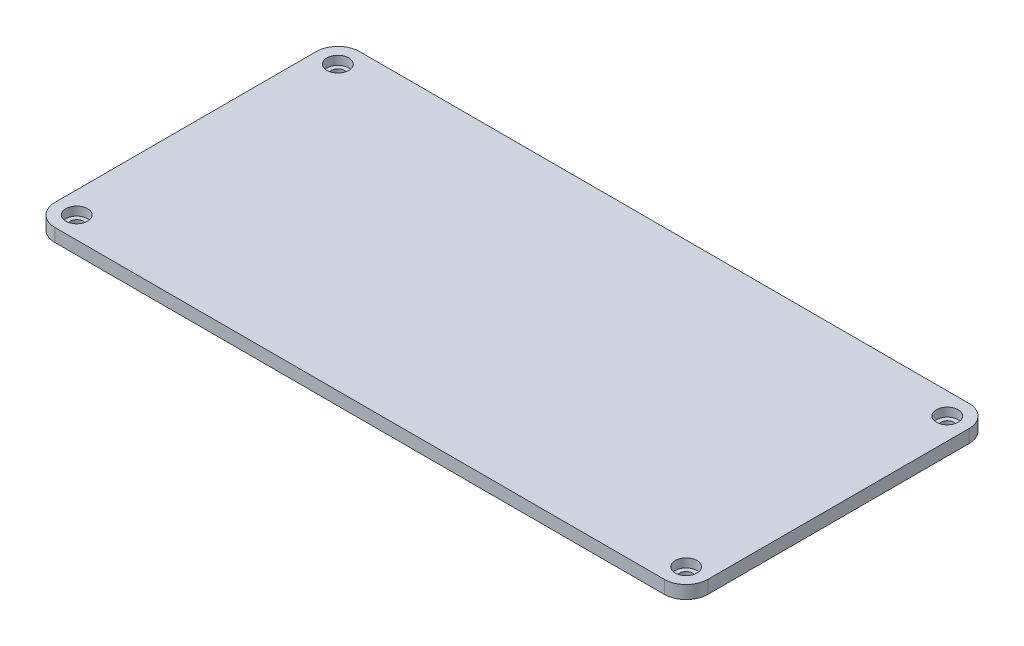
ISO-10303-21;
HEADER;
FILE_DESCRIPTION(('STEP AP214'),'2;1');
FILE_NAME('part.step','',(''),(''),'','','');
FILE_SCHEMA(('AUTOMOTIVE_DESIGN { 1 0 10303 214 1 1 1 1 }'));
ENDSEC;
DATA;
#1=APPLICATION_CONTEXT('core data for automotive mechanical design processes');
#2=APPLICATION_PROTOCOL_DEFINITION('international standard','automotive_design',2000,#1);
#3=PRODUCT_CONTEXT('',#1,'mechanical');
#4=PRODUCT('Part','Part','',(#3));
#5=PRODUCT_RELATED_PRODUCT_CATEGORY('part','',(#4));
#6=PRODUCT_DEFINITION_FORMATION('','',#4);
#7=PRODUCT_DEFINITION_CONTEXT('part definition',#1,'design');
#8=PRODUCT_DEFINITION('design','',#6,#7);
#9=PRODUCT_DEFINITION_SHAPE('','',#8);
#10=(LENGTH_UNIT() NAMED_UNIT(*) SI_UNIT(.MILLI.,.METRE.));
#11=(NAMED_UNIT(*) PLANE_ANGLE_UNIT() SI_UNIT($,.RADIAN.));
#12=(NAMED_UNIT(*) SI_UNIT($,.STERADIAN.) SOLID_ANGLE_UNIT());
#13=UNCERTAINTY_MEASURE_WITH_UNIT(LENGTH_MEASURE(1.E-05),#10,'distance_accuracy_value','');
#14=(GEOMETRIC_REPRESENTATION_CONTEXT(3) GLOBAL_UNCERTAINTY_ASSIGNED_CONTEXT((#13)) GLOBAL_UNIT_ASSIGNED_CONTEXT((#10,
#11,#12)) REPRESENTATION_CONTEXT('',''));
#15=CARTESIAN_POINT('',(0.,0.,0.));
#16=DIRECTION('',(0.,0.,1.));
#17=DIRECTION('',(1.,0.,0.));
#18=AXIS2_PLACEMENT_3D('',#15,#16,#17);
#19=CARTESIAN_POINT('',(0.,0.,0.));
#20=DIRECTION('',(0.,1.,0.));
#21=DIRECTION('',(0.,0.,1.));
#22=AXIS2_PLACEMENT_3D('',#19,#20,#21);
#23=PLANE('',#22);
#24=DIRECTION('',(0.,0.,1.));
#25=VECTOR('',#24,1.);
#26=CARTESIAN_POINT('',(30.0000000000018,0.,-32.0000000000099));
#27=LINE('',#26,#25);
#28=CARTESIAN_POINT('',(30.0000000000018,0.,-32.0000000000099));
#29=VERTEX_POINT('',#28);
#30=CARTESIAN_POINT('',(30.0000000000018,0.,-28.9999999999966));
#31=VERTEX_POINT('',#30);
#32=EDGE_CURVE('E218',#29,#31,#27,.T.);
#33=ORIENTED_EDGE('',*,*,#32,.F.);
#34=DIRECTION('',(1.,0.,0.));
#35=VECTOR('',#34,1.);
#36=CARTESIAN_POINT('',(-29.9999999999998,0.,-32.0000000000091));
#37=LINE('',#36,#35);
#38=CARTESIAN_POINT('',(-29.9999999999998,0.,-32.0000000000091));
#39=VERTEX_POINT('',#38);
#40=EDGE_CURVE('E231',#39,#29,#37,.T.);
#41=ORIENTED_EDGE('',*,*,#40,.F.);
#42=DIRECTION('',(0.,0.,-1.));
#43=VECTOR('',#42,1.);
#44=CARTESIAN_POINT('',(-29.9999999999998,0.,-32.0000000000091));
#45=LINE('',#44,#43);
#46=CARTESIAN_POINT('',(-29.9999999999998,0.,-28.9999999999968));
#47=VERTEX_POINT('',#46);
#48=EDGE_CURVE('E240',#47,#39,#45,.T.);
#49=ORIENTED_EDGE('',*,*,#48,.F.);
#50=DIRECTION('',(-1.,0.,0.));
#51=VECTOR('',#50,1.);
#52=CARTESIAN_POINT('',(-29.9999999999998,0.,-28.9999999999968));
#53=LINE('',#52,#51);
#54=EDGE_CURVE('E221',#31,#47,#53,.T.);
#55=ORIENTED_EDGE('',*,*,#54,.F.);
#56=EDGE_LOOP('',(#33,#41,#49,#55));
#57=FACE_BOUND('',#56,.T.);
#58=DIRECTION('',(-1.,0.,0.));
#59=VECTOR('',#58,1.);
#60=CARTESIAN_POINT('',(-72.000000000001,0.,14.9999999999932));
#61=LINE('',#60,#59);
#62=CARTESIAN_POINT('',(-68.9999999999886,0.,14.9999999999932));
#63=VERTEX_POINT('',#62);
#64=CARTESIAN_POINT('',(-72.000000000001,0.,14.9999999999932));
#65=VERTEX_POINT('',#64);
#66=EDGE_CURVE('E289',#63,#65,#61,.T.);
#67=ORIENTED_EDGE('',*,*,#66,.F.);
#68=DIRECTION('',(0.,0.,1.));
#69=VECTOR('',#68,1.);
#70=CARTESIAN_POINT('',(-68.9999999999886,0.,-14.9999999999898));
#71=LINE('',#70,#69);
#72=CARTESIAN_POINT('',(-68.9999999999886,0.,-14.9999999999898));
#73=VERTEX_POINT('',#72);
#74=EDGE_CURVE('E294',#73,#63,#71,.T.);
#75=ORIENTED_EDGE('',*,*,#74,.F.);
#76=DIRECTION('',(1.,0.,1.13682211791851E-12));
#77=VECTOR('',#76,1.);
#78=CARTESIAN_POINT('',(-72.0000000000017,0.,-14.9999999999932));
#79=LINE('',#78,#77);
#80=CARTESIAN_POINT('',(-72.0000000000017,0.,-14.9999999999932));
#81=VERTEX_POINT('',#80);
#82=EDGE_CURVE('E306',#81,#73,#79,.T.);
#83=ORIENTED_EDGE('',*,*,#82,.F.);
#84=DIRECTION('',(0.,0.,-1.));
#85=VECTOR('',#84,1.);
#86=CARTESIAN_POINT('',(-72.0000000000017,0.,-14.9999999999932));
#87=LINE('',#86,#85);
#88=EDGE_CURVE('E303',#65,#81,#87,.T.);
#89=ORIENTED_EDGE('',*,*,#88,.F.);
#90=EDGE_LOOP('',(#67,#75,#83,#89));
#91=FACE_BOUND('',#90,.T.);
#92=CARTESIAN_POINT('',(-69.9999999999926,0.,29.9999999999983));
#93=DIRECTION('',(0.,1.,0.));
#94=DIRECTION('',(0.,0.,1.));
#95=AXIS2_PLACEMENT_3D('',#92,#93,#94);
#96=CIRCLE('',#95,1.5);
#97=CARTESIAN_POINT('',(-69.9999999999926,0.,31.4999999999983));
#98=VERTEX_POINT('',#97);
#99=EDGE_CURVE('E354',#98,#98,#96,.T.);
#100=ORIENTED_EDGE('',*,*,#99,.T.);
#101=EDGE_LOOP('',(#100));
#102=FACE_BOUND('',#101,.T.);
#103=CARTESIAN_POINT('',(70.0000000000035,0.,29.9999999999975));
#104=DIRECTION('',(0.,1.,0.));
#105=DIRECTION('',(0.,0.,1.));
#106=AXIS2_PLACEMENT_3D('',#103,#104,#105);
#107=CIRCLE('',#106,1.5);
#108=CARTESIAN_POINT('',(70.0000000000035,0.,31.4999999999975));
#109=VERTEX_POINT('',#108);
#110=EDGE_CURVE('E351',#109,#109,#107,.T.);
#111=ORIENTED_EDGE('',*,*,#110,.T.);
#112=EDGE_LOOP('',(#111));
#113=FACE_BOUND('',#112,.T.);
#114=CARTESIAN_POINT('',(70.0000000000035,0.,-29.9999999999975));
#115=DIRECTION('',(0.,1.,0.));
#116=DIRECTION('',(0.,0.,1.));
#117=AXIS2_PLACEMENT_3D('',#114,#115,#116);
#118=CIRCLE('',#117,1.5);
#119=CARTESIAN_POINT('',(70.0000000000035,0.,-28.4999999999975));
#120=VERTEX_POINT('',#119);
#121=EDGE_CURVE('E347',#120,#120,#118,.T.);
#122=ORIENTED_EDGE('',*,*,#121,.T.);
#123=EDGE_LOOP('',(#122));
#124=FACE_BOUND('',#123,.T.);
#125=CARTESIAN_POINT('',(-69.9999999999926,0.,-29.9999999999983));
#126=DIRECTION('',(0.,1.,0.));
#127=DIRECTION('',(0.,0.,1.));
#128=AXIS2_PLACEMENT_3D('',#125,#126,#127);
#129=CIRCLE('',#128,1.5);
#130=CARTESIAN_POINT('',(-69.9999999999926,0.,-28.4999999999983));
#131=VERTEX_POINT('',#130);
#132=EDGE_CURVE('E350',#131,#131,#129,.T.);
#133=ORIENTED_EDGE('',*,*,#132,.T.);
#134=EDGE_LOOP('',(#133));
#135=FACE_BOUND('',#134,.T.);
#136=DIRECTION('',(-1.,0.,0.));
#137=VECTOR('',#136,1.);
#138=CARTESIAN_POINT('',(-74.9999999999926,0.,-34.9999999999983));
#139=LINE('',#138,#137);
#140=CARTESIAN_POINT('',(70.0000000000035,0.,-34.9999999999975));
#141=VERTEX_POINT('',#140);
#142=CARTESIAN_POINT('',(-69.9999999999925,0.,-34.9999999999983));
#143=VERTEX_POINT('',#142);
#144=EDGE_CURVE('E359',#141,#143,#139,.T.);
#145=ORIENTED_EDGE('',*,*,#144,.F.);
#146=CARTESIAN_POINT('',(70.0000000000035,0.,-29.9999999999975));
#147=DIRECTION('',(0.,1.,0.));
#148=DIRECTION('',(0.,0.,1.));
#149=AXIS2_PLACEMENT_3D('',#146,#147,#148);
#150=CIRCLE('',#149,5.);
#151=CARTESIAN_POINT('',(75.0000000000035,0.,-29.9999999999975));
#152=VERTEX_POINT('',#151);
#153=EDGE_CURVE('E394',#141,#152,#150,.F.);
#154=ORIENTED_EDGE('',*,*,#153,.T.);
#155=DIRECTION('',(0.,0.,-1.));
#156=VECTOR('',#155,1.);
#157=CARTESIAN_POINT('',(75.0000000000035,0.,34.9999999999974));
#158=LINE('',#157,#156);
#159=CARTESIAN_POINT('',(75.0000000000035,0.,29.9999999999975));
#160=VERTEX_POINT('',#159);
#161=EDGE_CURVE('E364',#160,#152,#158,.T.);
#162=ORIENTED_EDGE('',*,*,#161,.F.);
#163=CARTESIAN_POINT('',(70.0000000000035,0.,29.9999999999975));
#164=DIRECTION('',(0.,1.,0.));
#165=DIRECTION('',(0.,0.,1.));
#166=AXIS2_PLACEMENT_3D('',#163,#164,#165);
#167=CIRCLE('',#166,5.);
#168=CARTESIAN_POINT('',(70.0000000000035,0.,34.9999999999975));
#169=VERTEX_POINT('',#168);
#170=EDGE_CURVE('E390',#160,#169,#167,.F.);
#171=ORIENTED_EDGE('',*,*,#170,.T.);
#172=DIRECTION('',(1.,0.,0.));
#173=VECTOR('',#172,1.);
#174=CARTESIAN_POINT('',(-74.9999999999926,0.,34.9999999999983));
#175=LINE('',#174,#173);
#176=CARTESIAN_POINT('',(-69.9999999999925,0.,34.9999999999983));
#177=VERTEX_POINT('',#176);
#178=EDGE_CURVE('E379',#177,#169,#175,.T.);
#179=ORIENTED_EDGE('',*,*,#178,.F.);
#180=CARTESIAN_POINT('',(-69.9999999999926,0.,29.9999999999983));
#181=DIRECTION('',(0.,1.,0.));
#182=DIRECTION('',(0.,0.,1.));
#183=AXIS2_PLACEMENT_3D('',#180,#181,#182);
#184=CIRCLE('',#183,5.);
#185=CARTESIAN_POINT('',(-74.9999999999926,0.,29.9999999999983));
#186=VERTEX_POINT('',#185);
#187=EDGE_CURVE('E388',#177,#186,#184,.F.);
#188=ORIENTED_EDGE('',*,*,#187,.T.);
#189=DIRECTION('',(0.,0.,1.));
#190=VECTOR('',#189,1.);
#191=CARTESIAN_POINT('',(-74.9999999999926,0.,34.9999999999983));
#192=LINE('',#191,#190);
#193=CARTESIAN_POINT('',(-74.9999999999926,0.,-29.9999999999983));
#194=VERTEX_POINT('',#193);
#195=EDGE_CURVE('E376',#194,#186,#192,.T.);
#196=ORIENTED_EDGE('',*,*,#195,.F.);
#197=CARTESIAN_POINT('',(-69.9999999999926,0.,-29.9999999999983));
#198=DIRECTION('',(0.,1.,0.));
#199=DIRECTION('',(0.,0.,1.));
#200=AXIS2_PLACEMENT_3D('',#197,#198,#199);
#201=CIRCLE('',#200,5.);
#202=EDGE_CURVE('E392',#194,#143,#201,.F.);
#203=ORIENTED_EDGE('',*,*,#202,.T.);
#204=EDGE_LOOP('',(#145,#154,#162,#171,#179,#188,#196,#203));
#205=FACE_BOUND('',#204,.T.);
#206=DIRECTION('',(0.,0.,-1.));
#207=VECTOR('',#206,1.);
#208=CARTESIAN_POINT('',(-29.9999999999988,0.,28.9999999999973));
#209=LINE('',#208,#207);
#210=CARTESIAN_POINT('',(-29.9999999999988,0.,32.0000000000044));
#211=VERTEX_POINT('',#210);
#212=CARTESIAN_POINT('',(-29.9999999999988,0.,28.9999999999973));
#213=VERTEX_POINT('',#212);
#214=EDGE_CURVE('E256',#211,#213,#209,.T.);
#215=ORIENTED_EDGE('',*,*,#214,.F.);
#216=DIRECTION('',(-1.,0.,0.));
#217=VECTOR('',#216,1.);
#218=CARTESIAN_POINT('',(-29.9999999999988,0.,32.0000000000044));
#219=LINE('',#218,#217);
#220=CARTESIAN_POINT('',(30.0000000000035,0.,32.0000000000044));
#221=VERTEX_POINT('',#220);
#222=EDGE_CURVE('E261',#221,#211,#219,.T.);
#223=ORIENTED_EDGE('',*,*,#222,.F.);
#224=DIRECTION('',(0.,0.,1.));
#225=VECTOR('',#224,1.);
#226=CARTESIAN_POINT('',(30.0000000000035,0.,28.9999999999968));
#227=LINE('',#226,#225);
#228=CARTESIAN_POINT('',(30.0000000000035,0.,28.9999999999968));
#229=VERTEX_POINT('',#228);
#230=EDGE_CURVE('E273',#229,#221,#227,.T.);
#231=ORIENTED_EDGE('',*,*,#230,.F.);
#232=DIRECTION('',(1.,0.,0.));
#233=VECTOR('',#232,1.);
#234=CARTESIAN_POINT('',(-29.9999999999988,0.,28.9999999999973));
#235=LINE('',#234,#233);
#236=EDGE_CURVE('E270',#213,#229,#235,.T.);
#237=ORIENTED_EDGE('',*,*,#236,.F.);
#238=EDGE_LOOP('',(#215,#223,#231,#237));
#239=FACE_BOUND('',#238,.T.);
#240=DIRECTION('',(-1.,0.,0.));
#241=VECTOR('',#240,1.);
#242=CARTESIAN_POINT('',(69.000000000007,0.,14.9999999999932));
#243=LINE('',#242,#241);
#244=CARTESIAN_POINT('',(72.000000000007,0.,14.9999999999932));
#245=VERTEX_POINT('',#244);
#246=CARTESIAN_POINT('',(69.000000000007,0.,14.9999999999932));
#247=VERTEX_POINT('',#246);
#248=EDGE_CURVE('E217',#245,#247,#243,.T.);
#249=ORIENTED_EDGE('',*,*,#248,.F.);
#250=DIRECTION('',(0.,0.,1.));
#251=VECTOR('',#250,1.);
#252=CARTESIAN_POINT('',(72.000000000007,0.,-14.9999999999588));
#253=LINE('',#252,#251);
#254=CARTESIAN_POINT('',(72.000000000007,0.,-14.9999999999588));
#255=VERTEX_POINT('',#254);
#256=EDGE_CURVE('E214',#255,#245,#253,.T.);
#257=ORIENTED_EDGE('',*,*,#256,.F.);
#258=DIRECTION('',(1.,0.,0.));
#259=VECTOR('',#258,1.);
#260=CARTESIAN_POINT('',(69.000000000007,0.,-14.9999999999588));
#261=LINE('',#260,#259);
#262=CARTESIAN_POINT('',(69.000000000007,0.,-14.9999999999588));
#263=VERTEX_POINT('',#262);
#264=EDGE_CURVE('E57',#263,#255,#261,.T.);
#265=ORIENTED_EDGE('',*,*,#264,.F.);
#266=DIRECTION('',(0.,0.,-1.));
#267=VECTOR('',#266,1.);
#268=CARTESIAN_POINT('',(69.000000000007,0.,-14.9999999999588));
#269=LINE('',#268,#267);
#270=EDGE_CURVE('E52',#247,#263,#269,.T.);
#271=ORIENTED_EDGE('',*,*,#270,.F.);
#272=EDGE_LOOP('',(#249,#257,#265,#271));
#273=FACE_BOUND('',#272,.T.);
#274=ADVANCED_FACE('F35',(#57,#91,#102,#113,#124,#135,#205,#239,#273),#23,.F.);
#275=CARTESIAN_POINT('',(-69.9999999999926,0.,-29.9999999999983));
#276=DIRECTION('',(0.,1.,0.));
#277=DIRECTION('',(0.,0.,1.));
#278=AXIS2_PLACEMENT_3D('',#275,#276,#277);
#279=CYLINDRICAL_SURFACE('',#278,1.5);
#280=ORIENTED_EDGE('',*,*,#132,.F.);
#281=EDGE_LOOP('',(#280));
#282=FACE_BOUND('',#281,.T.);
#283=CARTESIAN_POINT('',(-69.9999999999926,1.,-29.9999999999983));
#284=DIRECTION('',(0.,1.,0.));
#285=DIRECTION('',(0.,0.,1.));
#286=AXIS2_PLACEMENT_3D('',#283,#284,#285);
#287=CIRCLE('',#286,1.5);
#288=CARTESIAN_POINT('',(-69.9999999999926,1.,-28.4999999999983));
#289=VERTEX_POINT('',#288);
#290=EDGE_CURVE('E39',#289,#289,#287,.F.);
#291=ORIENTED_EDGE('',*,*,#290,.F.);
#292=EDGE_LOOP('',(#291));
#293=FACE_BOUND('',#292,.T.);
#294=ADVANCED_FACE('F429',(#282,#293),#279,.F.);
#295=CARTESIAN_POINT('',(70.0000000000035,0.,-29.9999999999975));
#296=DIRECTION('',(0.,1.,0.));
#297=DIRECTION('',(0.,0.,1.));
#298=AXIS2_PLACEMENT_3D('',#295,#296,#297);
#299=CYLINDRICAL_SURFACE('',#298,1.5);
#300=ORIENTED_EDGE('',*,*,#121,.F.);
#301=EDGE_LOOP('',(#300));
#302=FACE_BOUND('',#301,.T.);
#303=CARTESIAN_POINT('',(70.0000000000035,1.,-29.9999999999975));
#304=DIRECTION('',(0.,1.,0.));
#305=DIRECTION('',(0.,0.,1.));
#306=AXIS2_PLACEMENT_3D('',#303,#304,#305);
#307=CIRCLE('',#306,1.5);
#308=CARTESIAN_POINT('',(70.0000000000035,1.,-28.4999999999975));
#309=VERTEX_POINT('',#308);
#310=EDGE_CURVE('E420',#309,#309,#307,.F.);
#311=ORIENTED_EDGE('',*,*,#310,.F.);
#312=EDGE_LOOP('',(#311));
#313=FACE_BOUND('',#312,.T.);
#314=ADVANCED_FACE('F431',(#302,#313),#299,.F.);
#315=CARTESIAN_POINT('',(70.0000000000035,0.,29.9999999999975));
#316=DIRECTION('',(0.,1.,0.));
#317=DIRECTION('',(0.,0.,1.));
#318=AXIS2_PLACEMENT_3D('',#315,#316,#317);
#319=CYLINDRICAL_SURFACE('',#318,1.5);
#320=ORIENTED_EDGE('',*,*,#110,.F.);
#321=EDGE_LOOP('',(#320));
#322=FACE_BOUND('',#321,.T.);
#323=CARTESIAN_POINT('',(70.0000000000035,1.,29.9999999999975));
#324=DIRECTION('',(0.,1.,0.));
#325=DIRECTION('',(0.,0.,1.));
#326=AXIS2_PLACEMENT_3D('',#323,#324,#325);
#327=CIRCLE('',#326,1.5);
#328=CARTESIAN_POINT('',(70.0000000000035,1.,31.4999999999975));
#329=VERTEX_POINT('',#328);
#330=EDGE_CURVE('E418',#329,#329,#327,.F.);
#331=ORIENTED_EDGE('',*,*,#330,.F.);
#332=EDGE_LOOP('',(#331));
#333=FACE_BOUND('',#332,.T.);
#334=ADVANCED_FACE('F438',(#322,#333),#319,.F.);
#335=CARTESIAN_POINT('',(-69.9999999999926,0.,29.9999999999983));
#336=DIRECTION('',(0.,1.,0.));
#337=DIRECTION('',(0.,0.,1.));
#338=AXIS2_PLACEMENT_3D('',#335,#336,#337);
#339=CYLINDRICAL_SURFACE('',#338,1.5);
#340=ORIENTED_EDGE('',*,*,#99,.F.);
#341=EDGE_LOOP('',(#340));
#342=FACE_BOUND('',#341,.T.);
#343=CARTESIAN_POINT('',(-69.9999999999926,1.,29.9999999999983));
#344=DIRECTION('',(0.,1.,0.));
#345=DIRECTION('',(0.,0.,1.));
#346=AXIS2_PLACEMENT_3D('',#343,#344,#345);
#347=CIRCLE('',#346,1.5);
#348=CARTESIAN_POINT('',(-69.9999999999926,1.,31.4999999999983));
#349=VERTEX_POINT('',#348);
#350=EDGE_CURVE('E344',#349,#349,#347,.F.);
#351=ORIENTED_EDGE('',*,*,#350,.F.);
#352=EDGE_LOOP('',(#351));
#353=FACE_BOUND('',#352,.T.);
#354=ADVANCED_FACE('F446',(#342,#353),#339,.F.);
#355=CARTESIAN_POINT('',(-74.9999999999926,3.,-34.9999999999983));
#356=DIRECTION('',(0.,0.,1.));
#357=DIRECTION('',(1.,0.,0.));
#358=AXIS2_PLACEMENT_3D('',#355,#356,#357);
#359=PLANE('',#358);
#360=DIRECTION('',(-1.,0.,0.));
#361=VECTOR('',#360,1.);
#362=CARTESIAN_POINT('',(-74.9999999999926,3.,-34.9999999999983));
#363=LINE('',#362,#361);
#364=CARTESIAN_POINT('',(70.0000000000035,3.,-34.9999999999975));
#365=VERTEX_POINT('',#364);
#366=CARTESIAN_POINT('',(-69.9999999999925,3.,-34.9999999999983));
#367=VERTEX_POINT('',#366);
#368=EDGE_CURVE('E360',#365,#367,#363,.T.);
#369=ORIENTED_EDGE('',*,*,#368,.F.);
#370=DIRECTION('',(0.,-1.,0.));
#371=VECTOR('',#370,1.);
#372=CARTESIAN_POINT('',(70.0000000000035,3.,-34.9999999999975));
#373=LINE('',#372,#371);
#374=EDGE_CURVE('E385',#365,#141,#373,.T.);
#375=ORIENTED_EDGE('',*,*,#374,.T.);
#376=ORIENTED_EDGE('',*,*,#144,.T.);
#377=DIRECTION('',(0.,-1.,0.));
#378=VECTOR('',#377,1.);
#379=CARTESIAN_POINT('',(-69.9999999999925,3.,-34.9999999999983));
#380=LINE('',#379,#378);
#381=EDGE_CURVE('E373',#143,#367,#380,.F.);
#382=ORIENTED_EDGE('',*,*,#381,.T.);
#383=EDGE_LOOP('',(#369,#375,#376,#382));
#384=FACE_BOUND('',#383,.T.);
#385=ADVANCED_FACE('F464',(#384),#359,.F.);
#386=CARTESIAN_POINT('',(-74.9999999999926,3.,34.9999999999983));
#387=DIRECTION('',(1.,0.,0.));
#388=DIRECTION('',(0.,0.,-1.));
#389=AXIS2_PLACEMENT_3D('',#386,#387,#388);
#390=PLANE('',#389);
#391=DIRECTION('',(0.,0.,1.));
#392=VECTOR('',#391,1.);
#393=CARTESIAN_POINT('',(-74.9999999999926,3.,34.9999999999983));
#394=LINE('',#393,#392);
#395=CARTESIAN_POINT('',(-74.9999999999926,3.,-29.9999999999983));
#396=VERTEX_POINT('',#395);
#397=CARTESIAN_POINT('',(-74.9999999999926,3.,29.9999999999983));
#398=VERTEX_POINT('',#397);
#399=EDGE_CURVE('E363',#396,#398,#394,.T.);
#400=ORIENTED_EDGE('',*,*,#399,.F.);
#401=DIRECTION('',(0.,-1.,0.));
#402=VECTOR('',#401,1.);
#403=CARTESIAN_POINT('',(-74.9999999999926,3.,-29.9999999999983));
#404=LINE('',#403,#402);
#405=EDGE_CURVE('E411',#396,#194,#404,.T.);
#406=ORIENTED_EDGE('',*,*,#405,.T.);
#407=ORIENTED_EDGE('',*,*,#195,.T.);
#408=DIRECTION('',(0.,-1.,0.));
#409=VECTOR('',#408,1.);
#410=CARTESIAN_POINT('',(-74.9999999999926,3.,29.9999999999983));
#411=LINE('',#410,#409);
#412=EDGE_CURVE('E409',#186,#398,#411,.F.);
#413=ORIENTED_EDGE('',*,*,#412,.T.);
#414=EDGE_LOOP('',(#400,#406,#407,#413));
#415=FACE_BOUND('',#414,.T.);
#416=ADVANCED_FACE('F460',(#415),#390,.F.);
#417=CARTESIAN_POINT('',(-74.9999999999926,3.,34.9999999999983));
#418=DIRECTION('',(0.,0.,-1.));
#419=DIRECTION('',(-1.,0.,0.));
#420=AXIS2_PLACEMENT_3D('',#417,#418,#419);
#421=PLANE('',#420);
#422=ORIENTED_EDGE('',*,*,#178,.T.);
#423=DIRECTION('',(0.,-1.,0.));
#424=VECTOR('',#423,1.);
#425=CARTESIAN_POINT('',(70.0000000000035,3.,34.9999999999975));
#426=LINE('',#425,#424);
#427=CARTESIAN_POINT('',(70.0000000000035,3.,34.9999999999975));
#428=VERTEX_POINT('',#427);
#429=EDGE_CURVE('E11',#169,#428,#426,.F.);
#430=ORIENTED_EDGE('',*,*,#429,.T.);
#431=DIRECTION('',(1.,0.,0.));
#432=VECTOR('',#431,1.);
#433=CARTESIAN_POINT('',(-74.9999999999926,3.,34.9999999999983));
#434=LINE('',#433,#432);
#435=CARTESIAN_POINT('',(-69.9999999999925,3.,34.9999999999983));
#436=VERTEX_POINT('',#435);
#437=EDGE_CURVE('E367',#436,#428,#434,.T.);
#438=ORIENTED_EDGE('',*,*,#437,.F.);
#439=DIRECTION('',(0.,-1.,0.));
#440=VECTOR('',#439,1.);
#441=CARTESIAN_POINT('',(-69.9999999999925,3.,34.9999999999983));
#442=LINE('',#441,#440);
#443=EDGE_CURVE('E44',#436,#177,#442,.T.);
#444=ORIENTED_EDGE('',*,*,#443,.T.);
#445=EDGE_LOOP('',(#422,#430,#438,#444));
#446=FACE_BOUND('',#445,.T.);
#447=ADVANCED_FACE('F456',(#446),#421,.F.);
#448=CARTESIAN_POINT('',(75.0000000000035,3.,34.9999999999974));
#449=DIRECTION('',(-1.,0.,0.));
#450=DIRECTION('',(0.,0.,1.));
#451=AXIS2_PLACEMENT_3D('',#448,#449,#450);
#452=PLANE('',#451);
#453=ORIENTED_EDGE('',*,*,#161,.T.);
#454=DIRECTION('',(0.,-1.,0.));
#455=VECTOR('',#454,1.);
#456=CARTESIAN_POINT('',(75.0000000000035,3.,-29.9999999999975));
#457=LINE('',#456,#455);
#458=CARTESIAN_POINT('',(75.0000000000035,3.,-29.9999999999975));
#459=VERTEX_POINT('',#458);
#460=EDGE_CURVE('E399',#152,#459,#457,.F.);
#461=ORIENTED_EDGE('',*,*,#460,.T.);
#462=DIRECTION('',(0.,0.,-1.));
#463=VECTOR('',#462,1.);
#464=CARTESIAN_POINT('',(75.0000000000035,3.,34.9999999999974));
#465=LINE('',#464,#463);
#466=CARTESIAN_POINT('',(75.0000000000035,3.,29.9999999999975));
#467=VERTEX_POINT('',#466);
#468=EDGE_CURVE('E370',#467,#459,#465,.T.);
#469=ORIENTED_EDGE('',*,*,#468,.F.);
#470=DIRECTION('',(0.,-1.,0.));
#471=VECTOR('',#470,1.);
#472=CARTESIAN_POINT('',(75.0000000000035,3.,29.9999999999975));
#473=LINE('',#472,#471);
#474=EDGE_CURVE('E396',#467,#160,#473,.T.);
#475=ORIENTED_EDGE('',*,*,#474,.T.);
#476=EDGE_LOOP('',(#453,#461,#469,#475));
#477=FACE_BOUND('',#476,.T.);
#478=ADVANCED_FACE('F451',(#477),#452,.F.);
#479=CARTESIAN_POINT('',(0.,3.,0.));
#480=DIRECTION('',(0.,1.,0.));
#481=DIRECTION('',(0.,0.,1.));
#482=AXIS2_PLACEMENT_3D('',#479,#480,#481);
#483=PLANE('',#482);
#484=CARTESIAN_POINT('',(-69.9999999999926,3.,29.9999999999983));
#485=DIRECTION('',(0.,1.,0.));
#486=DIRECTION('',(0.,0.,1.));
#487=AXIS2_PLACEMENT_3D('',#484,#485,#486);
#488=CIRCLE('',#487,2.5);
#489=CARTESIAN_POINT('',(-69.9999999999926,3.,32.4999999999983));
#490=VERTEX_POINT('',#489);
#491=EDGE_CURVE('E322',#490,#490,#488,.T.);
#492=ORIENTED_EDGE('',*,*,#491,.F.);
#493=EDGE_LOOP('',(#492));
#494=FACE_BOUND('',#493,.T.);
#495=CARTESIAN_POINT('',(70.0000000000035,3.,29.9999999999975));
#496=DIRECTION('',(0.,1.,0.));
#497=DIRECTION('',(0.,0.,1.));
#498=AXIS2_PLACEMENT_3D('',#495,#496,#497);
#499=CIRCLE('',#498,2.5);
#500=CARTESIAN_POINT('',(70.0000000000035,3.,32.4999999999975));
#501=VERTEX_POINT('',#500);
#502=EDGE_CURVE('E333',#501,#501,#499,.T.);
#503=ORIENTED_EDGE('',*,*,#502,.F.);
#504=EDGE_LOOP('',(#503));
#505=FACE_BOUND('',#504,.T.);
#506=CARTESIAN_POINT('',(70.0000000000035,3.,-29.9999999999975));
#507=DIRECTION('',(0.,1.,0.));
#508=DIRECTION('',(0.,0.,1.));
#509=AXIS2_PLACEMENT_3D('',#506,#507,#508);
#510=CIRCLE('',#509,2.5);
#511=CARTESIAN_POINT('',(70.0000000000035,3.,-27.4999999999975));
#512=VERTEX_POINT('',#511);
#513=EDGE_CURVE('E327',#512,#512,#510,.T.);
#514=ORIENTED_EDGE('',*,*,#513,.F.);
#515=EDGE_LOOP('',(#514));
#516=FACE_BOUND('',#515,.T.);
#517=CARTESIAN_POINT('',(-69.9999999999926,3.,-29.9999999999983));
#518=DIRECTION('',(0.,1.,0.));
#519=DIRECTION('',(0.,0.,1.));
#520=AXIS2_PLACEMENT_3D('',#517,#518,#519);
#521=CIRCLE('',#520,2.5);
#522=CARTESIAN_POINT('',(-69.9999999999926,3.,-27.4999999999983));
#523=VERTEX_POINT('',#522);
#524=EDGE_CURVE('E326',#523,#523,#521,.T.);
#525=ORIENTED_EDGE('',*,*,#524,.F.);
#526=EDGE_LOOP('',(#525));
#527=FACE_BOUND('',#526,.T.);
#528=ORIENTED_EDGE('',*,*,#468,.T.);
#529=CARTESIAN_POINT('',(70.0000000000035,3.,-29.9999999999975));
#530=DIRECTION('',(0.,1.,0.));
#531=DIRECTION('',(0.,0.,1.));
#532=AXIS2_PLACEMENT_3D('',#529,#530,#531);
#533=CIRCLE('',#532,5.);
#534=EDGE_CURVE('E407',#459,#365,#533,.T.);
#535=ORIENTED_EDGE('',*,*,#534,.T.);
#536=ORIENTED_EDGE('',*,*,#368,.T.);
#537=CARTESIAN_POINT('',(-69.9999999999926,3.,-29.9999999999983));
#538=DIRECTION('',(0.,1.,0.));
#539=DIRECTION('',(0.,0.,1.));
#540=AXIS2_PLACEMENT_3D('',#537,#538,#539);
#541=CIRCLE('',#540,5.);
#542=EDGE_CURVE('E405',#367,#396,#541,.T.);
#543=ORIENTED_EDGE('',*,*,#542,.T.);
#544=ORIENTED_EDGE('',*,*,#399,.T.);
#545=CARTESIAN_POINT('',(-69.9999999999926,3.,29.9999999999983));
#546=DIRECTION('',(0.,1.,0.));
#547=DIRECTION('',(0.,0.,1.));
#548=AXIS2_PLACEMENT_3D('',#545,#546,#547);
#549=CIRCLE('',#548,5.);
#550=EDGE_CURVE('E401',#398,#436,#549,.T.);
#551=ORIENTED_EDGE('',*,*,#550,.T.);
#552=ORIENTED_EDGE('',*,*,#437,.T.);
#553=CARTESIAN_POINT('',(70.0000000000035,3.,29.9999999999975));
#554=DIRECTION('',(0.,1.,0.));
#555=DIRECTION('',(0.,0.,1.));
#556=AXIS2_PLACEMENT_3D('',#553,#554,#555);
#557=CIRCLE('',#556,5.);
#558=EDGE_CURVE('E403',#428,#467,#557,.T.);
#559=ORIENTED_EDGE('',*,*,#558,.T.);
#560=EDGE_LOOP('',(#528,#535,#536,#543,#544,#551,#552,#559));
#561=FACE_BOUND('',#560,.T.);
#562=ADVANCED_FACE('F448',(#494,#505,#516,#527,#561),#483,.T.);
#563=CARTESIAN_POINT('',(70.0000000000035,3.,-29.9999999999975));
#564=DIRECTION('',(0.,-1.,0.));
#565=DIRECTION('',(0.,0.,-1.));
#566=AXIS2_PLACEMENT_3D('',#563,#564,#565);
#567=CYLINDRICAL_SURFACE('',#566,5.);
#568=ORIENTED_EDGE('',*,*,#534,.F.);
#569=ORIENTED_EDGE('',*,*,#460,.F.);
#570=ORIENTED_EDGE('',*,*,#153,.F.);
#571=ORIENTED_EDGE('',*,*,#374,.F.);
#572=EDGE_LOOP('',(#568,#569,#570,#571));
#573=FACE_BOUND('',#572,.T.);
#574=ADVANCED_FACE('F450',(#573),#567,.T.);
#575=CARTESIAN_POINT('',(-69.9999999999926,3.,-29.9999999999983));
#576=DIRECTION('',(0.,-1.,0.));
#577=DIRECTION('',(0.,0.,-1.));
#578=AXIS2_PLACEMENT_3D('',#575,#576,#577);
#579=CYLINDRICAL_SURFACE('',#578,5.);
#580=ORIENTED_EDGE('',*,*,#542,.F.);
#581=ORIENTED_EDGE('',*,*,#381,.F.);
#582=ORIENTED_EDGE('',*,*,#202,.F.);
#583=ORIENTED_EDGE('',*,*,#405,.F.);
#584=EDGE_LOOP('',(#580,#581,#582,#583));
#585=FACE_BOUND('',#584,.T.);
#586=ADVANCED_FACE('F471',(#585),#579,.T.);
#587=CARTESIAN_POINT('',(70.0000000000035,3.,29.9999999999975));
#588=DIRECTION('',(0.,-1.,0.));
#589=DIRECTION('',(0.,0.,-1.));
#590=AXIS2_PLACEMENT_3D('',#587,#588,#589);
#591=CYLINDRICAL_SURFACE('',#590,5.);
#592=ORIENTED_EDGE('',*,*,#558,.F.);
#593=ORIENTED_EDGE('',*,*,#429,.F.);
#594=ORIENTED_EDGE('',*,*,#170,.F.);
#595=ORIENTED_EDGE('',*,*,#474,.F.);
#596=EDGE_LOOP('',(#592,#593,#594,#595));
#597=FACE_BOUND('',#596,.T.);
#598=ADVANCED_FACE('F474',(#597),#591,.T.);
#599=CARTESIAN_POINT('',(-69.9999999999926,3.,29.9999999999983));
#600=DIRECTION('',(0.,-1.,0.));
#601=DIRECTION('',(0.,0.,-1.));
#602=AXIS2_PLACEMENT_3D('',#599,#600,#601);
#603=CYLINDRICAL_SURFACE('',#602,5.);
#604=ORIENTED_EDGE('',*,*,#550,.F.);
#605=ORIENTED_EDGE('',*,*,#412,.F.);
#606=ORIENTED_EDGE('',*,*,#187,.F.);
#607=ORIENTED_EDGE('',*,*,#443,.F.);
#608=EDGE_LOOP('',(#604,#605,#606,#607));
#609=FACE_BOUND('',#608,.T.);
#610=ADVANCED_FACE('F37',(#609),#603,.T.);
#611=CARTESIAN_POINT('',(-69.9999999999926,1.,29.9999999999983));
#612=DIRECTION('',(0.,1.,0.));
#613=DIRECTION('',(0.,0.,1.));
#614=AXIS2_PLACEMENT_3D('',#611,#612,#613);
#615=PLANE('',#614);
#616=CARTESIAN_POINT('',(-69.9999999999926,1.,29.9999999999983));
#617=DIRECTION('',(0.,1.,0.));
#618=DIRECTION('',(0.,0.,1.));
#619=AXIS2_PLACEMENT_3D('',#616,#617,#618);
#620=CIRCLE('',#619,2.5);
#621=CARTESIAN_POINT('',(-69.9999999999926,1.,32.4999999999983));
#622=VERTEX_POINT('',#621);
#623=EDGE_CURVE('E336',#622,#622,#620,.T.);
#624=ORIENTED_EDGE('',*,*,#623,.T.);
#625=EDGE_LOOP('',(#624));
#626=FACE_BOUND('',#625,.T.);
#627=ORIENTED_EDGE('',*,*,#350,.T.);
#628=EDGE_LOOP('',(#627));
#629=FACE_BOUND('',#628,.T.);
#630=ADVANCED_FACE('F481',(#626,#629),#615,.T.);
#631=CARTESIAN_POINT('',(-69.9999999999926,1.,29.9999999999983));
#632=DIRECTION('',(0.,1.,0.));
#633=DIRECTION('',(0.,0.,1.));
#634=AXIS2_PLACEMENT_3D('',#631,#632,#633);
#635=CYLINDRICAL_SURFACE('',#634,2.5);
#636=ORIENTED_EDGE('',*,*,#623,.F.);
#637=EDGE_LOOP('',(#636));
#638=FACE_BOUND('',#637,.T.);
#639=ORIENTED_EDGE('',*,*,#491,.T.);
#640=EDGE_LOOP('',(#639));
#641=FACE_BOUND('',#640,.T.);
#642=ADVANCED_FACE('F606',(#638,#641),#635,.F.);
#643=CARTESIAN_POINT('',(70.0000000000035,1.,29.9999999999975));
#644=DIRECTION('',(0.,1.,0.));
#645=DIRECTION('',(0.,0.,1.));
#646=AXIS2_PLACEMENT_3D('',#643,#644,#645);
#647=PLANE('',#646);
#648=CARTESIAN_POINT('',(70.0000000000035,1.,29.9999999999975));
#649=DIRECTION('',(0.,1.,0.));
#650=DIRECTION('',(0.,0.,1.));
#651=AXIS2_PLACEMENT_3D('',#648,#649,#650);
#652=CIRCLE('',#651,2.5);
#653=CARTESIAN_POINT('',(70.0000000000035,1.,32.4999999999975));
#654=VERTEX_POINT('',#653);
#655=EDGE_CURVE('E330',#654,#654,#652,.T.);
#656=ORIENTED_EDGE('',*,*,#655,.T.);
#657=EDGE_LOOP('',(#656));
#658=FACE_BOUND('',#657,.T.);
#659=ORIENTED_EDGE('',*,*,#330,.T.);
#660=EDGE_LOOP('',(#659));
#661=FACE_BOUND('',#660,.T.);
#662=ADVANCED_FACE('F603',(#658,#661),#647,.T.);
#663=CARTESIAN_POINT('',(70.0000000000035,1.,29.9999999999975));
#664=DIRECTION('',(0.,1.,0.));
#665=DIRECTION('',(0.,0.,1.));
#666=AXIS2_PLACEMENT_3D('',#663,#664,#665);
#667=CYLINDRICAL_SURFACE('',#666,2.5);
#668=ORIENTED_EDGE('',*,*,#655,.F.);
#669=EDGE_LOOP('',(#668));
#670=FACE_BOUND('',#669,.T.);
#671=ORIENTED_EDGE('',*,*,#502,.T.);
#672=EDGE_LOOP('',(#671));
#673=FACE_BOUND('',#672,.T.);
#674=ADVANCED_FACE('F598',(#670,#673),#667,.F.);
#675=CARTESIAN_POINT('',(70.0000000000035,1.,-29.9999999999975));
#676=DIRECTION('',(0.,1.,0.));
#677=DIRECTION('',(0.,0.,1.));
#678=AXIS2_PLACEMENT_3D('',#675,#676,#677);
#679=PLANE('',#678);
#680=CARTESIAN_POINT('',(70.0000000000035,1.,-29.9999999999975));
#681=DIRECTION('',(0.,1.,0.));
#682=DIRECTION('',(0.,0.,1.));
#683=AXIS2_PLACEMENT_3D('',#680,#681,#682);
#684=CIRCLE('',#683,2.5);
#685=CARTESIAN_POINT('',(70.0000000000035,1.,-27.4999999999975));
#686=VERTEX_POINT('',#685);
#687=EDGE_CURVE('E323',#686,#686,#684,.T.);
#688=ORIENTED_EDGE('',*,*,#687,.T.);
#689=EDGE_LOOP('',(#688));
#690=FACE_BOUND('',#689,.T.);
#691=ORIENTED_EDGE('',*,*,#310,.T.);
#692=EDGE_LOOP('',(#691));
#693=FACE_BOUND('',#692,.T.);
#694=ADVANCED_FACE('F594',(#690,#693),#679,.T.);
#695=CARTESIAN_POINT('',(70.0000000000035,1.,-29.9999999999975));
#696=DIRECTION('',(0.,1.,0.));
#697=DIRECTION('',(0.,0.,1.));
#698=AXIS2_PLACEMENT_3D('',#695,#696,#697);
#699=CYLINDRICAL_SURFACE('',#698,2.5);
#700=ORIENTED_EDGE('',*,*,#687,.F.);
#701=EDGE_LOOP('',(#700));
#702=FACE_BOUND('',#701,.T.);
#703=ORIENTED_EDGE('',*,*,#513,.T.);
#704=EDGE_LOOP('',(#703));
#705=FACE_BOUND('',#704,.T.);
#706=ADVANCED_FACE('F597',(#702,#705),#699,.F.);
#707=CARTESIAN_POINT('',(-69.9999999999926,1.,-29.9999999999983));
#708=DIRECTION('',(0.,1.,0.));
#709=DIRECTION('',(0.,0.,1.));
#710=AXIS2_PLACEMENT_3D('',#707,#708,#709);
#711=PLANE('',#710);
#712=CARTESIAN_POINT('',(-69.9999999999926,1.,-29.9999999999983));
#713=DIRECTION('',(0.,1.,0.));
#714=DIRECTION('',(0.,0.,1.));
#715=AXIS2_PLACEMENT_3D('',#712,#713,#714);
#716=CIRCLE('',#715,2.5);
#717=CARTESIAN_POINT('',(-69.9999999999926,1.,-27.4999999999983));
#718=VERTEX_POINT('',#717);
#719=EDGE_CURVE('E341',#718,#718,#716,.T.);
#720=ORIENTED_EDGE('',*,*,#719,.T.);
#721=EDGE_LOOP('',(#720));
#722=FACE_BOUND('',#721,.T.);
#723=ORIENTED_EDGE('',*,*,#290,.T.);
#724=EDGE_LOOP('',(#723));
#725=FACE_BOUND('',#724,.T.);
#726=ADVANCED_FACE('F427',(#722,#725),#711,.T.);
#727=CARTESIAN_POINT('',(-69.9999999999926,1.,-29.9999999999983));
#728=DIRECTION('',(0.,1.,0.));
#729=DIRECTION('',(0.,0.,1.));
#730=AXIS2_PLACEMENT_3D('',#727,#728,#729);
#731=CYLINDRICAL_SURFACE('',#730,2.5);
#732=ORIENTED_EDGE('',*,*,#719,.F.);
#733=EDGE_LOOP('',(#732));
#734=FACE_BOUND('',#733,.T.);
#735=ORIENTED_EDGE('',*,*,#524,.T.);
#736=EDGE_LOOP('',(#735));
#737=FACE_BOUND('',#736,.T.);
#738=ADVANCED_FACE('F592',(#734,#737),#731,.F.);
#739=CARTESIAN_POINT('',(-72.000000000001,-2.,14.9999999999932));
#740=DIRECTION('',(0.,0.,-1.));
#741=DIRECTION('',(-1.,0.,0.));
#742=AXIS2_PLACEMENT_3D('',#739,#740,#741);
#743=PLANE('',#742);
#744=ORIENTED_EDGE('',*,*,#66,.T.);
#745=DIRECTION('',(0.,1.,0.));
#746=VECTOR('',#745,1.);
#747=CARTESIAN_POINT('',(-72.000000000001,-2.,14.9999999999932));
#748=LINE('',#747,#746);
#749=CARTESIAN_POINT('',(-72.000000000001,-2.,14.9999999999932));
#750=VERTEX_POINT('',#749);
#751=EDGE_CURVE('E319',#750,#65,#748,.T.);
#752=ORIENTED_EDGE('',*,*,#751,.F.);
#753=DIRECTION('',(-1.,0.,0.));
#754=VECTOR('',#753,1.);
#755=CARTESIAN_POINT('',(-72.000000000001,-2.,14.9999999999932));
#756=LINE('',#755,#754);
#757=CARTESIAN_POINT('',(-68.9999999999886,-2.,14.9999999999932));
#758=VERTEX_POINT('',#757);
#759=EDGE_CURVE('E290',#758,#750,#756,.T.);
#760=ORIENTED_EDGE('',*,*,#759,.F.);
#761=DIRECTION('',(0.,1.,0.));
#762=VECTOR('',#761,1.);
#763=CARTESIAN_POINT('',(-68.9999999999886,-2.,14.9999999999932));
#764=LINE('',#763,#762);
#765=EDGE_CURVE('E300',#758,#63,#764,.T.);
#766=ORIENTED_EDGE('',*,*,#765,.T.);
#767=EDGE_LOOP('',(#744,#752,#760,#766));
#768=FACE_BOUND('',#767,.T.);
#769=ADVANCED_FACE('F588',(#768),#743,.F.);
#770=CARTESIAN_POINT('',(-72.0000000000017,-2.,-14.9999999999932));
#771=DIRECTION('',(1.,0.,0.));
#772=DIRECTION('',(0.,0.,-1.));
#773=AXIS2_PLACEMENT_3D('',#770,#771,#772);
#774=PLANE('',#773);
#775=ORIENTED_EDGE('',*,*,#88,.T.);
#776=DIRECTION('',(0.,1.,0.));
#777=VECTOR('',#776,1.);
#778=CARTESIAN_POINT('',(-72.0000000000017,-2.,-14.9999999999932));
#779=LINE('',#778,#777);
#780=CARTESIAN_POINT('',(-72.0000000000017,-2.,-14.9999999999932));
#781=VERTEX_POINT('',#780);
#782=EDGE_CURVE('E316',#781,#81,#779,.T.);
#783=ORIENTED_EDGE('',*,*,#782,.F.);
#784=DIRECTION('',(0.,0.,-1.));
#785=VECTOR('',#784,1.);
#786=CARTESIAN_POINT('',(-72.0000000000017,-2.,-14.9999999999932));
#787=LINE('',#786,#785);
#788=EDGE_CURVE('E293',#750,#781,#787,.T.);
#789=ORIENTED_EDGE('',*,*,#788,.F.);
#790=ORIENTED_EDGE('',*,*,#751,.T.);
#791=EDGE_LOOP('',(#775,#783,#789,#790));
#792=FACE_BOUND('',#791,.T.);
#793=ADVANCED_FACE('F584',(#792),#774,.F.);
#794=CARTESIAN_POINT('',(-72.0000000000017,-2.,-14.9999999999932));
#795=DIRECTION('',(-1.13682211791851E-12,0.,1.));
#796=DIRECTION('',(1.,0.,1.13682211791851E-12));
#797=AXIS2_PLACEMENT_3D('',#794,#795,#796);
#798=PLANE('',#797);
#799=ORIENTED_EDGE('',*,*,#82,.T.);
#800=DIRECTION('',(0.,1.,0.));
#801=VECTOR('',#800,1.);
#802=CARTESIAN_POINT('',(-68.9999999999886,-2.,-14.9999999999898));
#803=LINE('',#802,#801);
#804=CARTESIAN_POINT('',(-68.9999999999886,-2.,-14.9999999999898));
#805=VERTEX_POINT('',#804);
#806=EDGE_CURVE('E313',#805,#73,#803,.T.);
#807=ORIENTED_EDGE('',*,*,#806,.F.);
#808=DIRECTION('',(1.,0.,1.13682211791851E-12));
#809=VECTOR('',#808,1.);
#810=CARTESIAN_POINT('',(-72.0000000000017,-2.,-14.9999999999932));
#811=LINE('',#810,#809);
#812=EDGE_CURVE('E296',#781,#805,#811,.T.);
#813=ORIENTED_EDGE('',*,*,#812,.F.);
#814=ORIENTED_EDGE('',*,*,#782,.T.);
#815=EDGE_LOOP('',(#799,#807,#813,#814));
#816=FACE_BOUND('',#815,.T.);
#817=ADVANCED_FACE('F580',(#816),#798,.F.);
#818=CARTESIAN_POINT('',(-68.9999999999886,-2.,-14.9999999999898));
#819=DIRECTION('',(-1.,0.,0.));
#820=DIRECTION('',(0.,0.,1.));
#821=AXIS2_PLACEMENT_3D('',#818,#819,#820);
#822=PLANE('',#821);
#823=ORIENTED_EDGE('',*,*,#74,.T.);
#824=ORIENTED_EDGE('',*,*,#765,.F.);
#825=DIRECTION('',(0.,0.,1.));
#826=VECTOR('',#825,1.);
#827=CARTESIAN_POINT('',(-68.9999999999886,-2.,-14.9999999999898));
#828=LINE('',#827,#826);
#829=EDGE_CURVE('E298',#805,#758,#828,.T.);
#830=ORIENTED_EDGE('',*,*,#829,.F.);
#831=ORIENTED_EDGE('',*,*,#806,.T.);
#832=EDGE_LOOP('',(#823,#824,#830,#831));
#833=FACE_BOUND('',#832,.T.);
#834=ADVANCED_FACE('F576',(#833),#822,.F.);
#835=CARTESIAN_POINT('',(0.,-2.,0.));
#836=DIRECTION('',(0.,-1.,0.));
#837=DIRECTION('',(0.,0.,-1.));
#838=AXIS2_PLACEMENT_3D('',#835,#836,#837);
#839=PLANE('',#838);
#840=ORIENTED_EDGE('',*,*,#759,.T.);
#841=ORIENTED_EDGE('',*,*,#788,.T.);
#842=ORIENTED_EDGE('',*,*,#812,.T.);
#843=ORIENTED_EDGE('',*,*,#829,.T.);
#844=EDGE_LOOP('',(#840,#841,#842,#843));
#845=FACE_BOUND('',#844,.T.);
#846=ADVANCED_FACE('F572',(#845),#839,.T.);
#847=CARTESIAN_POINT('',(-29.9999999999988,-2.,28.9999999999973));
#848=DIRECTION('',(1.,0.,0.));
#849=DIRECTION('',(0.,0.,-1.));
#850=AXIS2_PLACEMENT_3D('',#847,#848,#849);
#851=PLANE('',#850);
#852=ORIENTED_EDGE('',*,*,#214,.T.);
#853=DIRECTION('',(0.,1.,0.));
#854=VECTOR('',#853,1.);
#855=CARTESIAN_POINT('',(-29.9999999999988,-2.,28.9999999999973));
#856=LINE('',#855,#854);
#857=CARTESIAN_POINT('',(-29.9999999999988,-2.,28.9999999999973));
#858=VERTEX_POINT('',#857);
#859=EDGE_CURVE('E286',#858,#213,#856,.T.);
#860=ORIENTED_EDGE('',*,*,#859,.F.);
#861=DIRECTION('',(0.,0.,-1.));
#862=VECTOR('',#861,1.);
#863=CARTESIAN_POINT('',(-29.9999999999988,-2.,28.9999999999973));
#864=LINE('',#863,#862);
#865=CARTESIAN_POINT('',(-29.9999999999988,-2.,32.0000000000044));
#866=VERTEX_POINT('',#865);
#867=EDGE_CURVE('E257',#866,#858,#864,.T.);
#868=ORIENTED_EDGE('',*,*,#867,.F.);
#869=DIRECTION('',(0.,1.,0.));
#870=VECTOR('',#869,1.);
#871=CARTESIAN_POINT('',(-29.9999999999988,-2.,32.0000000000044));
#872=LINE('',#871,#870);
#873=EDGE_CURVE('E267',#866,#211,#872,.T.);
#874=ORIENTED_EDGE('',*,*,#873,.T.);
#875=EDGE_LOOP('',(#852,#860,#868,#874));
#876=FACE_BOUND('',#875,.T.);
#877=ADVANCED_FACE('F568',(#876),#851,.F.);
#878=CARTESIAN_POINT('',(-29.9999999999988,-2.,28.9999999999973));
#879=DIRECTION('',(0.,0.,1.));
#880=DIRECTION('',(1.,0.,0.));
#881=AXIS2_PLACEMENT_3D('',#878,#879,#880);
#882=PLANE('',#881);
#883=ORIENTED_EDGE('',*,*,#236,.T.);
#884=DIRECTION('',(0.,1.,0.));
#885=VECTOR('',#884,1.);
#886=CARTESIAN_POINT('',(30.0000000000035,-2.,28.9999999999968));
#887=LINE('',#886,#885);
#888=CARTESIAN_POINT('',(30.0000000000035,-2.,28.9999999999968));
#889=VERTEX_POINT('',#888);
#890=EDGE_CURVE('E283',#889,#229,#887,.T.);
#891=ORIENTED_EDGE('',*,*,#890,.F.);
#892=DIRECTION('',(1.,0.,0.));
#893=VECTOR('',#892,1.);
#894=CARTESIAN_POINT('',(-29.9999999999988,-2.,28.9999999999973));
#895=LINE('',#894,#893);
#896=EDGE_CURVE('E260',#858,#889,#895,.T.);
#897=ORIENTED_EDGE('',*,*,#896,.F.);
#898=ORIENTED_EDGE('',*,*,#859,.T.);
#899=EDGE_LOOP('',(#883,#891,#897,#898));
#900=FACE_BOUND('',#899,.T.);
#901=ADVANCED_FACE('F564',(#900),#882,.F.);
#902=CARTESIAN_POINT('',(30.0000000000035,-2.,28.9999999999968));
#903=DIRECTION('',(-1.,0.,0.));
#904=DIRECTION('',(0.,0.,1.));
#905=AXIS2_PLACEMENT_3D('',#902,#903,#904);
#906=PLANE('',#905);
#907=ORIENTED_EDGE('',*,*,#230,.T.);
#908=DIRECTION('',(0.,1.,0.));
#909=VECTOR('',#908,1.);
#910=CARTESIAN_POINT('',(30.0000000000035,-2.,32.0000000000044));
#911=LINE('',#910,#909);
#912=CARTESIAN_POINT('',(30.0000000000035,-2.,32.0000000000044));
#913=VERTEX_POINT('',#912);
#914=EDGE_CURVE('E280',#913,#221,#911,.T.);
#915=ORIENTED_EDGE('',*,*,#914,.F.);
#916=DIRECTION('',(0.,0.,1.));
#917=VECTOR('',#916,1.);
#918=CARTESIAN_POINT('',(30.0000000000035,-2.,28.9999999999968));
#919=LINE('',#918,#917);
#920=EDGE_CURVE('E263',#889,#913,#919,.T.);
#921=ORIENTED_EDGE('',*,*,#920,.F.);
#922=ORIENTED_EDGE('',*,*,#890,.T.);
#923=EDGE_LOOP('',(#907,#915,#921,#922));
#924=FACE_BOUND('',#923,.T.);
#925=ADVANCED_FACE('F560',(#924),#906,.F.);
#926=CARTESIAN_POINT('',(-29.9999999999988,-2.,32.0000000000044));
#927=DIRECTION('',(0.,0.,-1.));
#928=DIRECTION('',(-1.,0.,0.));
#929=AXIS2_PLACEMENT_3D('',#926,#927,#928);
#930=PLANE('',#929);
#931=ORIENTED_EDGE('',*,*,#222,.T.);
#932=ORIENTED_EDGE('',*,*,#873,.F.);
#933=DIRECTION('',(-1.,0.,0.));
#934=VECTOR('',#933,1.);
#935=CARTESIAN_POINT('',(-29.9999999999988,-2.,32.0000000000044));
#936=LINE('',#935,#934);
#937=EDGE_CURVE('E265',#913,#866,#936,.T.);
#938=ORIENTED_EDGE('',*,*,#937,.F.);
#939=ORIENTED_EDGE('',*,*,#914,.T.);
#940=EDGE_LOOP('',(#931,#932,#938,#939));
#941=FACE_BOUND('',#940,.T.);
#942=ADVANCED_FACE('F556',(#941),#930,.F.);
#943=CARTESIAN_POINT('',(0.,-2.,0.));
#944=DIRECTION('',(0.,1.,0.));
#945=DIRECTION('',(0.,0.,1.));
#946=AXIS2_PLACEMENT_3D('',#943,#944,#945);
#947=PLANE('',#946);
#948=ORIENTED_EDGE('',*,*,#867,.T.);
#949=ORIENTED_EDGE('',*,*,#896,.T.);
#950=ORIENTED_EDGE('',*,*,#920,.T.);
#951=ORIENTED_EDGE('',*,*,#937,.T.);
#952=EDGE_LOOP('',(#948,#949,#950,#951));
#953=FACE_BOUND('',#952,.T.);
#954=ADVANCED_FACE('F552',(#953),#947,.F.);
#955=CARTESIAN_POINT('',(30.0000000000018,-2.,-32.0000000000099));
#956=DIRECTION('',(-1.,0.,0.));
#957=DIRECTION('',(0.,0.,1.));
#958=AXIS2_PLACEMENT_3D('',#955,#956,#957);
#959=PLANE('',#958);
#960=ORIENTED_EDGE('',*,*,#32,.T.);
#961=DIRECTION('',(0.,1.,0.));
#962=VECTOR('',#961,1.);
#963=CARTESIAN_POINT('',(30.0000000000018,-2.,-28.9999999999966));
#964=LINE('',#963,#962);
#965=CARTESIAN_POINT('',(30.0000000000018,-2.,-28.9999999999966));
#966=VERTEX_POINT('',#965);
#967=EDGE_CURVE('E253',#966,#31,#964,.T.);
#968=ORIENTED_EDGE('',*,*,#967,.F.);
#969=DIRECTION('',(0.,0.,1.));
#970=VECTOR('',#969,1.);
#971=CARTESIAN_POINT('',(30.0000000000018,-2.,-32.0000000000099));
#972=LINE('',#971,#970);
#973=CARTESIAN_POINT('',(30.0000000000018,-2.,-32.0000000000099));
#974=VERTEX_POINT('',#973);
#975=EDGE_CURVE('E227',#974,#966,#972,.T.);
#976=ORIENTED_EDGE('',*,*,#975,.F.);
#977=DIRECTION('',(0.,1.,0.));
#978=VECTOR('',#977,1.);
#979=CARTESIAN_POINT('',(30.0000000000018,-2.,-32.0000000000099));
#980=LINE('',#979,#978);
#981=EDGE_CURVE('E236',#974,#29,#980,.T.);
#982=ORIENTED_EDGE('',*,*,#981,.T.);
#983=EDGE_LOOP('',(#960,#968,#976,#982));
#984=FACE_BOUND('',#983,.T.);
#985=ADVANCED_FACE('F548',(#984),#959,.F.);
#986=CARTESIAN_POINT('',(-29.9999999999998,-2.,-28.9999999999968));
#987=DIRECTION('',(0.,0.,-1.));
#988=DIRECTION('',(-1.,0.,0.));
#989=AXIS2_PLACEMENT_3D('',#986,#987,#988);
#990=PLANE('',#989);
#991=ORIENTED_EDGE('',*,*,#54,.T.);
#992=DIRECTION('',(0.,1.,0.));
#993=VECTOR('',#992,1.);
#994=CARTESIAN_POINT('',(-29.9999999999998,-2.,-28.9999999999968));
#995=LINE('',#994,#993);
#996=CARTESIAN_POINT('',(-29.9999999999998,-2.,-28.9999999999968));
#997=VERTEX_POINT('',#996);
#998=EDGE_CURVE('E250',#997,#47,#995,.T.);
#999=ORIENTED_EDGE('',*,*,#998,.F.);
#1000=DIRECTION('',(-1.,0.,0.));
#1001=VECTOR('',#1000,1.);
#1002=CARTESIAN_POINT('',(-29.9999999999998,-2.,-28.9999999999968));
#1003=LINE('',#1002,#1001);
#1004=EDGE_CURVE('E230',#966,#997,#1003,.T.);
#1005=ORIENTED_EDGE('',*,*,#1004,.F.);
#1006=ORIENTED_EDGE('',*,*,#967,.T.);
#1007=EDGE_LOOP('',(#991,#999,#1005,#1006));
#1008=FACE_BOUND('',#1007,.T.);
#1009=ADVANCED_FACE('F544',(#1008),#990,.F.);
#1010=CARTESIAN_POINT('',(-29.9999999999998,-2.,-32.0000000000091));
#1011=DIRECTION('',(1.,0.,0.));
#1012=DIRECTION('',(0.,0.,-1.));
#1013=AXIS2_PLACEMENT_3D('',#1010,#1011,#1012);
#1014=PLANE('',#1013);
#1015=ORIENTED_EDGE('',*,*,#48,.T.);
#1016=DIRECTION('',(0.,1.,0.));
#1017=VECTOR('',#1016,1.);
#1018=CARTESIAN_POINT('',(-29.9999999999998,-2.,-32.0000000000091));
#1019=LINE('',#1018,#1017);
#1020=CARTESIAN_POINT('',(-29.9999999999998,-2.,-32.0000000000091));
#1021=VERTEX_POINT('',#1020);
#1022=EDGE_CURVE('E247',#1021,#39,#1019,.T.);
#1023=ORIENTED_EDGE('',*,*,#1022,.F.);
#1024=DIRECTION('',(0.,0.,-1.));
#1025=VECTOR('',#1024,1.);
#1026=CARTESIAN_POINT('',(-29.9999999999998,-2.,-32.0000000000091));
#1027=LINE('',#1026,#1025);
#1028=EDGE_CURVE('E233',#997,#1021,#1027,.T.);
#1029=ORIENTED_EDGE('',*,*,#1028,.F.);
#1030=ORIENTED_EDGE('',*,*,#998,.T.);
#1031=EDGE_LOOP('',(#1015,#1023,#1029,#1030));
#1032=FACE_BOUND('',#1031,.T.);
#1033=ADVANCED_FACE('F540',(#1032),#1014,.F.);
#1034=CARTESIAN_POINT('',(-29.9999999999998,-2.,-32.0000000000091));
#1035=DIRECTION('',(0.,0.,1.));
#1036=DIRECTION('',(1.,0.,0.));
#1037=AXIS2_PLACEMENT_3D('',#1034,#1035,#1036);
#1038=PLANE('',#1037);
#1039=ORIENTED_EDGE('',*,*,#40,.T.);
#1040=ORIENTED_EDGE('',*,*,#981,.F.);
#1041=DIRECTION('',(1.,0.,0.));
#1042=VECTOR('',#1041,1.);
#1043=CARTESIAN_POINT('',(-29.9999999999998,-2.,-32.0000000000091));
#1044=LINE('',#1043,#1042);
#1045=EDGE_CURVE('E235',#1021,#974,#1044,.T.);
#1046=ORIENTED_EDGE('',*,*,#1045,.F.);
#1047=ORIENTED_EDGE('',*,*,#1022,.T.);
#1048=EDGE_LOOP('',(#1039,#1040,#1046,#1047));
#1049=FACE_BOUND('',#1048,.T.);
#1050=ADVANCED_FACE('F536',(#1049),#1038,.F.);
#1051=CARTESIAN_POINT('',(0.,-2.,0.));
#1052=DIRECTION('',(0.,1.,0.));
#1053=DIRECTION('',(0.,0.,1.));
#1054=AXIS2_PLACEMENT_3D('',#1051,#1052,#1053);
#1055=PLANE('',#1054);
#1056=ORIENTED_EDGE('',*,*,#975,.T.);
#1057=ORIENTED_EDGE('',*,*,#1004,.T.);
#1058=ORIENTED_EDGE('',*,*,#1028,.T.);
#1059=ORIENTED_EDGE('',*,*,#1045,.T.);
#1060=EDGE_LOOP('',(#1056,#1057,#1058,#1059));
#1061=FACE_BOUND('',#1060,.T.);
#1062=ADVANCED_FACE('F533',(#1061),#1055,.F.);
#1063=CARTESIAN_POINT('',(69.000000000007,-2.,14.9999999999932));
#1064=DIRECTION('',(0.,0.,-1.));
#1065=DIRECTION('',(-1.,0.,0.));
#1066=AXIS2_PLACEMENT_3D('',#1063,#1064,#1065);
#1067=PLANE('',#1066);
#1068=ORIENTED_EDGE('',*,*,#248,.T.);
#1069=DIRECTION('',(0.,1.,0.));
#1070=VECTOR('',#1069,1.);
#1071=CARTESIAN_POINT('',(69.000000000007,-2.,14.9999999999932));
#1072=LINE('',#1071,#1070);
#1073=CARTESIAN_POINT('',(69.000000000007,-2.,14.9999999999932));
#1074=VERTEX_POINT('',#1073);
#1075=EDGE_CURVE('E198',#1074,#247,#1072,.T.);
#1076=ORIENTED_EDGE('',*,*,#1075,.F.);
#1077=DIRECTION('',(-1.,0.,0.));
#1078=VECTOR('',#1077,1.);
#1079=CARTESIAN_POINT('',(69.000000000007,-2.,14.9999999999932));
#1080=LINE('',#1079,#1078);
#1081=CARTESIAN_POINT('',(72.000000000007,-2.,14.9999999999932));
#1082=VERTEX_POINT('',#1081);
#1083=EDGE_CURVE('E205',#1082,#1074,#1080,.T.);
#1084=ORIENTED_EDGE('',*,*,#1083,.F.);
#1085=DIRECTION('',(0.,1.,0.));
#1086=VECTOR('',#1085,1.);
#1087=CARTESIAN_POINT('',(72.000000000007,-2.,14.9999999999932));
#1088=LINE('',#1087,#1086);
#1089=EDGE_CURVE('E511',#1082,#245,#1088,.T.);
#1090=ORIENTED_EDGE('',*,*,#1089,.T.);
#1091=EDGE_LOOP('',(#1068,#1076,#1084,#1090));
#1092=FACE_BOUND('',#1091,.T.);
#1093=ADVANCED_FACE('F216',(#1092),#1067,.F.);
#1094=CARTESIAN_POINT('',(69.000000000007,-2.,-14.9999999999588));
#1095=DIRECTION('',(1.,0.,0.));
#1096=DIRECTION('',(0.,0.,-1.));
#1097=AXIS2_PLACEMENT_3D('',#1094,#1095,#1096);
#1098=PLANE('',#1097);
#1099=ORIENTED_EDGE('',*,*,#270,.T.);
#1100=DIRECTION('',(0.,1.,0.));
#1101=VECTOR('',#1100,1.);
#1102=CARTESIAN_POINT('',(69.000000000007,-2.,-14.9999999999588));
#1103=LINE('',#1102,#1101);
#1104=CARTESIAN_POINT('',(69.000000000007,-2.,-14.9999999999588));
#1105=VERTEX_POINT('',#1104);
#1106=EDGE_CURVE('E201',#1105,#263,#1103,.T.);
#1107=ORIENTED_EDGE('',*,*,#1106,.F.);
#1108=DIRECTION('',(0.,0.,-1.));
#1109=VECTOR('',#1108,1.);
#1110=CARTESIAN_POINT('',(69.000000000007,-2.,-14.9999999999588));
#1111=LINE('',#1110,#1109);
#1112=EDGE_CURVE('E194',#1074,#1105,#1111,.T.);
#1113=ORIENTED_EDGE('',*,*,#1112,.F.);
#1114=ORIENTED_EDGE('',*,*,#1075,.T.);
#1115=EDGE_LOOP('',(#1099,#1107,#1113,#1114));
#1116=FACE_BOUND('',#1115,.T.);
#1117=ADVANCED_FACE('F196',(#1116),#1098,.F.);
#1118=CARTESIAN_POINT('',(69.000000000007,-2.,-14.9999999999588));
#1119=DIRECTION('',(0.,0.,1.));
#1120=DIRECTION('',(1.,0.,0.));
#1121=AXIS2_PLACEMENT_3D('',#1118,#1119,#1120);
#1122=PLANE('',#1121);
#1123=ORIENTED_EDGE('',*,*,#264,.T.);
#1124=DIRECTION('',(0.,1.,0.));
#1125=VECTOR('',#1124,1.);
#1126=CARTESIAN_POINT('',(72.000000000007,-2.,-14.9999999999588));
#1127=LINE('',#1126,#1125);
#1128=CARTESIAN_POINT('',(72.000000000007,-2.,-14.9999999999588));
#1129=VERTEX_POINT('',#1128);
#1130=EDGE_CURVE('E223',#1129,#255,#1127,.T.);
#1131=ORIENTED_EDGE('',*,*,#1130,.F.);
#1132=DIRECTION('',(1.,0.,0.));
#1133=VECTOR('',#1132,1.);
#1134=CARTESIAN_POINT('',(69.000000000007,-2.,-14.9999999999588));
#1135=LINE('',#1134,#1133);
#1136=EDGE_CURVE('E204',#1105,#1129,#1135,.T.);
#1137=ORIENTED_EDGE('',*,*,#1136,.F.);
#1138=ORIENTED_EDGE('',*,*,#1106,.T.);
#1139=EDGE_LOOP('',(#1123,#1131,#1137,#1138));
#1140=FACE_BOUND('',#1139,.T.);
#1141=ADVANCED_FACE('F520',(#1140),#1122,.F.);
#1142=CARTESIAN_POINT('',(72.000000000007,-2.,-14.9999999999588));
#1143=DIRECTION('',(-1.,0.,0.));
#1144=DIRECTION('',(0.,0.,1.));
#1145=AXIS2_PLACEMENT_3D('',#1142,#1143,#1144);
#1146=PLANE('',#1145);
#1147=ORIENTED_EDGE('',*,*,#256,.T.);
#1148=ORIENTED_EDGE('',*,*,#1089,.F.);
#1149=DIRECTION('',(0.,0.,1.));
#1150=VECTOR('',#1149,1.);
#1151=CARTESIAN_POINT('',(72.000000000007,-2.,-14.9999999999588));
#1152=LINE('',#1151,#1150);
#1153=EDGE_CURVE('E210',#1129,#1082,#1152,.T.);
#1154=ORIENTED_EDGE('',*,*,#1153,.F.);
#1155=ORIENTED_EDGE('',*,*,#1130,.T.);
#1156=EDGE_LOOP('',(#1147,#1148,#1154,#1155));
#1157=FACE_BOUND('',#1156,.T.);
#1158=ADVANCED_FACE('F510',(#1157),#1146,.F.);
#1159=CARTESIAN_POINT('',(0.,-2.,0.));
#1160=DIRECTION('',(0.,-1.,0.));
#1161=DIRECTION('',(0.,0.,-1.));
#1162=AXIS2_PLACEMENT_3D('',#1159,#1160,#1161);
#1163=PLANE('',#1162);
#1164=ORIENTED_EDGE('',*,*,#1083,.T.);
#1165=ORIENTED_EDGE('',*,*,#1112,.T.);
#1166=ORIENTED_EDGE('',*,*,#1136,.T.);
#1167=ORIENTED_EDGE('',*,*,#1153,.T.);
#1168=EDGE_LOOP('',(#1164,#1165,#1166,#1167));
#1169=FACE_BOUND('',#1168,.T.);
#1170=ADVANCED_FACE('F208',(#1169),#1163,.T.);
#1171=CLOSED_SHELL('',(#274,#294,#314,#334,#354,#385,#416,#447,#478,#562,#574,#586,#598,#610,
#630,#642,#662,#674,#694,#706,#726,#738,#769,#793,#817,#834,#846,#877,#901,#925,#942,#954,#985,
#1009,#1033,#1050,#1062,#1093,#1117,#1141,#1158,#1170));
#1172=MANIFOLD_SOLID_BREP('B2',#1171);
#1173=ADVANCED_BREP_SHAPE_REPRESENTATION('',(#18,#1172),#14);
#1174=SHAPE_DEFINITION_REPRESENTATION(#9,#1173);
ENDSEC;
END-ISO-10303-21;
